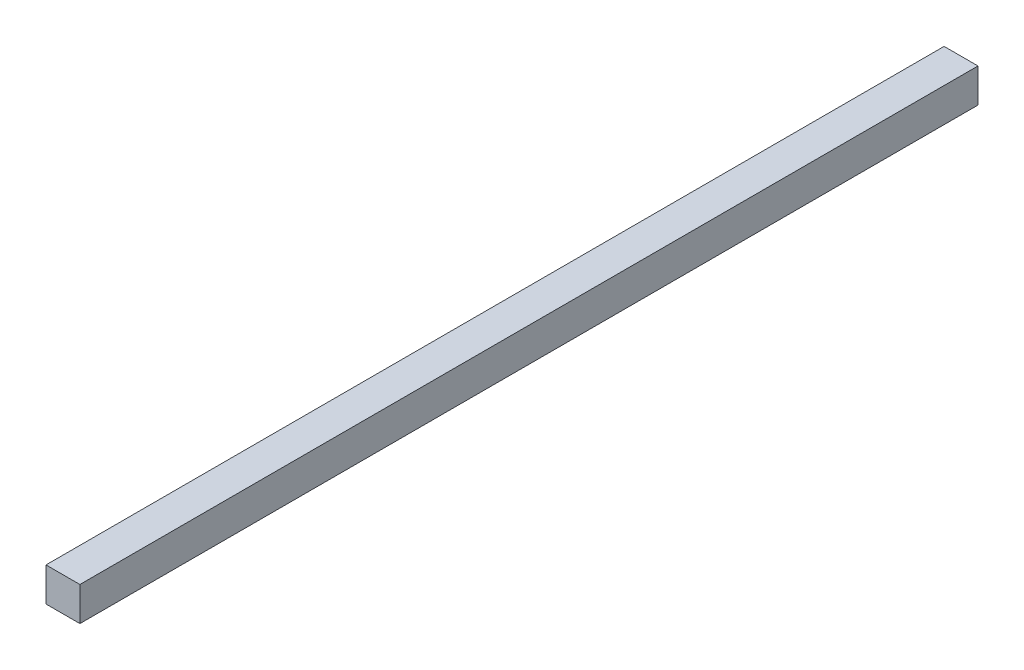
ISO-10303-21;
HEADER;
FILE_DESCRIPTION(('STEP AP214'),'2;1');
FILE_NAME('part.step','',(''),(''),'','','');
FILE_SCHEMA(('AUTOMOTIVE_DESIGN { 1 0 10303 214 1 1 1 1 }'));
ENDSEC;
DATA;
#1=APPLICATION_CONTEXT('core data for automotive mechanical design processes');
#2=APPLICATION_PROTOCOL_DEFINITION('international standard','automotive_design',2000,#1);
#3=PRODUCT_CONTEXT('',#1,'mechanical');
#4=PRODUCT('Part','Part','',(#3));
#5=PRODUCT_RELATED_PRODUCT_CATEGORY('part','',(#4));
#6=PRODUCT_DEFINITION_FORMATION('','',#4);
#7=PRODUCT_DEFINITION_CONTEXT('part definition',#1,'design');
#8=PRODUCT_DEFINITION('design','',#6,#7);
#9=PRODUCT_DEFINITION_SHAPE('','',#8);
#10=(LENGTH_UNIT() NAMED_UNIT(*) SI_UNIT(.MILLI.,.METRE.));
#11=(NAMED_UNIT(*) PLANE_ANGLE_UNIT() SI_UNIT($,.RADIAN.));
#12=(NAMED_UNIT(*) SI_UNIT($,.STERADIAN.) SOLID_ANGLE_UNIT());
#13=UNCERTAINTY_MEASURE_WITH_UNIT(LENGTH_MEASURE(1.E-05),#10,'distance_accuracy_value','');
#14=(GEOMETRIC_REPRESENTATION_CONTEXT(3) GLOBAL_UNCERTAINTY_ASSIGNED_CONTEXT((#13)) GLOBAL_UNIT_ASSIGNED_CONTEXT((#10,
#11,#12)) REPRESENTATION_CONTEXT('',''));
#15=CARTESIAN_POINT('',(0.,0.,0.));
#16=DIRECTION('',(0.,0.,1.));
#17=DIRECTION('',(1.,0.,0.));
#18=AXIS2_PLACEMENT_3D('',#15,#16,#17);
#19=CARTESIAN_POINT('',(-5.,-5.,-265.));
#20=DIRECTION('',(-1.,0.,0.));
#21=DIRECTION('',(0.,0.,1.));
#22=AXIS2_PLACEMENT_3D('',#19,#20,#21);
#23=PLANE('',#22);
#24=DIRECTION('',(0.,-1.,0.));
#25=VECTOR('',#24,1.);
#26=CARTESIAN_POINT('',(-5.,-5.,0.));
#27=LINE('',#26,#25);
#28=CARTESIAN_POINT('',(-5.,5.,0.));
#29=VERTEX_POINT('',#28);
#30=CARTESIAN_POINT('',(-5.,-5.,0.));
#31=VERTEX_POINT('',#30);
#32=EDGE_CURVE('E103',#29,#31,#27,.T.);
#33=ORIENTED_EDGE('',*,*,#32,.F.);
#34=DIRECTION('',(0.,0.,1.));
#35=VECTOR('',#34,1.);
#36=CARTESIAN_POINT('',(-5.,5.,-265.));
#37=LINE('',#36,#35);
#38=CARTESIAN_POINT('',(-5.,5.,-265.));
#39=VERTEX_POINT('',#38);
#40=EDGE_CURVE('E11',#39,#29,#37,.T.);
#41=ORIENTED_EDGE('',*,*,#40,.F.);
#42=DIRECTION('',(0.,-1.,0.));
#43=VECTOR('',#42,1.);
#44=CARTESIAN_POINT('',(-5.,-5.,-265.));
#45=LINE('',#44,#43);
#46=CARTESIAN_POINT('',(-5.,-5.,-265.));
#47=VERTEX_POINT('',#46);
#48=EDGE_CURVE('E97',#39,#47,#45,.T.);
#49=ORIENTED_EDGE('',*,*,#48,.T.);
#50=DIRECTION('',(0.,0.,1.));
#51=VECTOR('',#50,1.);
#52=CARTESIAN_POINT('',(-5.,-5.,-265.));
#53=LINE('',#52,#51);
#54=EDGE_CURVE('E42',#47,#31,#53,.T.);
#55=ORIENTED_EDGE('',*,*,#54,.T.);
#56=EDGE_LOOP('',(#33,#41,#49,#55));
#57=FACE_BOUND('',#56,.T.);
#58=ADVANCED_FACE('F39',(#57),#23,.T.);
#59=CARTESIAN_POINT('',(-5.,5.,-265.));
#60=DIRECTION('',(0.,1.,0.));
#61=DIRECTION('',(0.,0.,1.));
#62=AXIS2_PLACEMENT_3D('',#59,#60,#61);
#63=PLANE('',#62);
#64=DIRECTION('',(-1.,0.,0.));
#65=VECTOR('',#64,1.);
#66=CARTESIAN_POINT('',(-5.,5.,0.));
#67=LINE('',#66,#65);
#68=CARTESIAN_POINT('',(5.,5.,0.));
#69=VERTEX_POINT('',#68);
#70=EDGE_CURVE('E99',#69,#29,#67,.T.);
#71=ORIENTED_EDGE('',*,*,#70,.F.);
#72=DIRECTION('',(0.,0.,1.));
#73=VECTOR('',#72,1.);
#74=CARTESIAN_POINT('',(5.,5.,-265.));
#75=LINE('',#74,#73);
#76=CARTESIAN_POINT('',(5.,5.,-265.));
#77=VERTEX_POINT('',#76);
#78=EDGE_CURVE('E48',#77,#69,#75,.T.);
#79=ORIENTED_EDGE('',*,*,#78,.F.);
#80=DIRECTION('',(-1.,0.,0.));
#81=VECTOR('',#80,1.);
#82=CARTESIAN_POINT('',(-5.,5.,-265.));
#83=LINE('',#82,#81);
#84=EDGE_CURVE('E94',#77,#39,#83,.T.);
#85=ORIENTED_EDGE('',*,*,#84,.T.);
#86=ORIENTED_EDGE('',*,*,#40,.T.);
#87=EDGE_LOOP('',(#71,#79,#85,#86));
#88=FACE_BOUND('',#87,.T.);
#89=ADVANCED_FACE('F113',(#88),#63,.T.);
#90=CARTESIAN_POINT('',(5.,-5.,-265.));
#91=DIRECTION('',(1.,0.,0.));
#92=DIRECTION('',(0.,0.,-1.));
#93=AXIS2_PLACEMENT_3D('',#90,#91,#92);
#94=PLANE('',#93);
#95=DIRECTION('',(0.,1.,0.));
#96=VECTOR('',#95,1.);
#97=CARTESIAN_POINT('',(5.,-5.,0.));
#98=LINE('',#97,#96);
#99=CARTESIAN_POINT('',(5.,-5.,0.));
#100=VERTEX_POINT('',#99);
#101=EDGE_CURVE('E89',#100,#69,#98,.T.);
#102=ORIENTED_EDGE('',*,*,#101,.F.);
#103=DIRECTION('',(0.,0.,1.));
#104=VECTOR('',#103,1.);
#105=CARTESIAN_POINT('',(5.,-5.,-265.));
#106=LINE('',#105,#104);
#107=CARTESIAN_POINT('',(5.,-5.,-265.));
#108=VERTEX_POINT('',#107);
#109=EDGE_CURVE('E84',#108,#100,#106,.T.);
#110=ORIENTED_EDGE('',*,*,#109,.F.);
#111=DIRECTION('',(0.,1.,0.));
#112=VECTOR('',#111,1.);
#113=CARTESIAN_POINT('',(5.,-5.,-265.));
#114=LINE('',#113,#112);
#115=EDGE_CURVE('E87',#108,#77,#114,.T.);
#116=ORIENTED_EDGE('',*,*,#115,.T.);
#117=ORIENTED_EDGE('',*,*,#78,.T.);
#118=EDGE_LOOP('',(#102,#110,#116,#117));
#119=FACE_BOUND('',#118,.T.);
#120=ADVANCED_FACE('F86',(#119),#94,.T.);
#121=CARTESIAN_POINT('',(-5.,-5.,-265.));
#122=DIRECTION('',(0.,-1.,0.));
#123=DIRECTION('',(0.,0.,-1.));
#124=AXIS2_PLACEMENT_3D('',#121,#122,#123);
#125=PLANE('',#124);
#126=DIRECTION('',(1.,0.,0.));
#127=VECTOR('',#126,1.);
#128=CARTESIAN_POINT('',(-5.,-5.,0.));
#129=LINE('',#128,#127);
#130=EDGE_CURVE('E106',#31,#100,#129,.T.);
#131=ORIENTED_EDGE('',*,*,#130,.F.);
#132=ORIENTED_EDGE('',*,*,#54,.F.);
#133=DIRECTION('',(1.,0.,0.));
#134=VECTOR('',#133,1.);
#135=CARTESIAN_POINT('',(-5.,-5.,-265.));
#136=LINE('',#135,#134);
#137=EDGE_CURVE('E93',#47,#108,#136,.T.);
#138=ORIENTED_EDGE('',*,*,#137,.T.);
#139=ORIENTED_EDGE('',*,*,#109,.T.);
#140=EDGE_LOOP('',(#131,#132,#138,#139));
#141=FACE_BOUND('',#140,.T.);
#142=ADVANCED_FACE('F96',(#141),#125,.T.);
#143=CARTESIAN_POINT('',(0.,0.,-265.));
#144=DIRECTION('',(0.,0.,-1.));
#145=DIRECTION('',(-1.,0.,0.));
#146=AXIS2_PLACEMENT_3D('',#143,#144,#145);
#147=PLANE('',#146);
#148=ORIENTED_EDGE('',*,*,#48,.F.);
#149=ORIENTED_EDGE('',*,*,#84,.F.);
#150=ORIENTED_EDGE('',*,*,#115,.F.);
#151=ORIENTED_EDGE('',*,*,#137,.F.);
#152=EDGE_LOOP('',(#148,#149,#150,#151));
#153=FACE_BOUND('',#152,.T.);
#154=ADVANCED_FACE('F92',(#153),#147,.T.);
#155=CARTESIAN_POINT('',(0.,0.,0.));
#156=DIRECTION('',(0.,0.,-1.));
#157=DIRECTION('',(-1.,0.,0.));
#158=AXIS2_PLACEMENT_3D('',#155,#156,#157);
#159=PLANE('',#158);
#160=ORIENTED_EDGE('',*,*,#32,.T.);
#161=ORIENTED_EDGE('',*,*,#130,.T.);
#162=ORIENTED_EDGE('',*,*,#101,.T.);
#163=ORIENTED_EDGE('',*,*,#70,.T.);
#164=EDGE_LOOP('',(#160,#161,#162,#163));
#165=FACE_BOUND('',#164,.T.);
#166=ADVANCED_FACE('F112',(#165),#159,.F.);
#167=CLOSED_SHELL('',(#58,#89,#120,#142,#154,#166));
#168=MANIFOLD_SOLID_BREP('B2',#167);
#169=ADVANCED_BREP_SHAPE_REPRESENTATION('',(#18,#168),#14);
#170=SHAPE_DEFINITION_REPRESENTATION(#9,#169);
ENDSEC;
END-ISO-10303-21;
